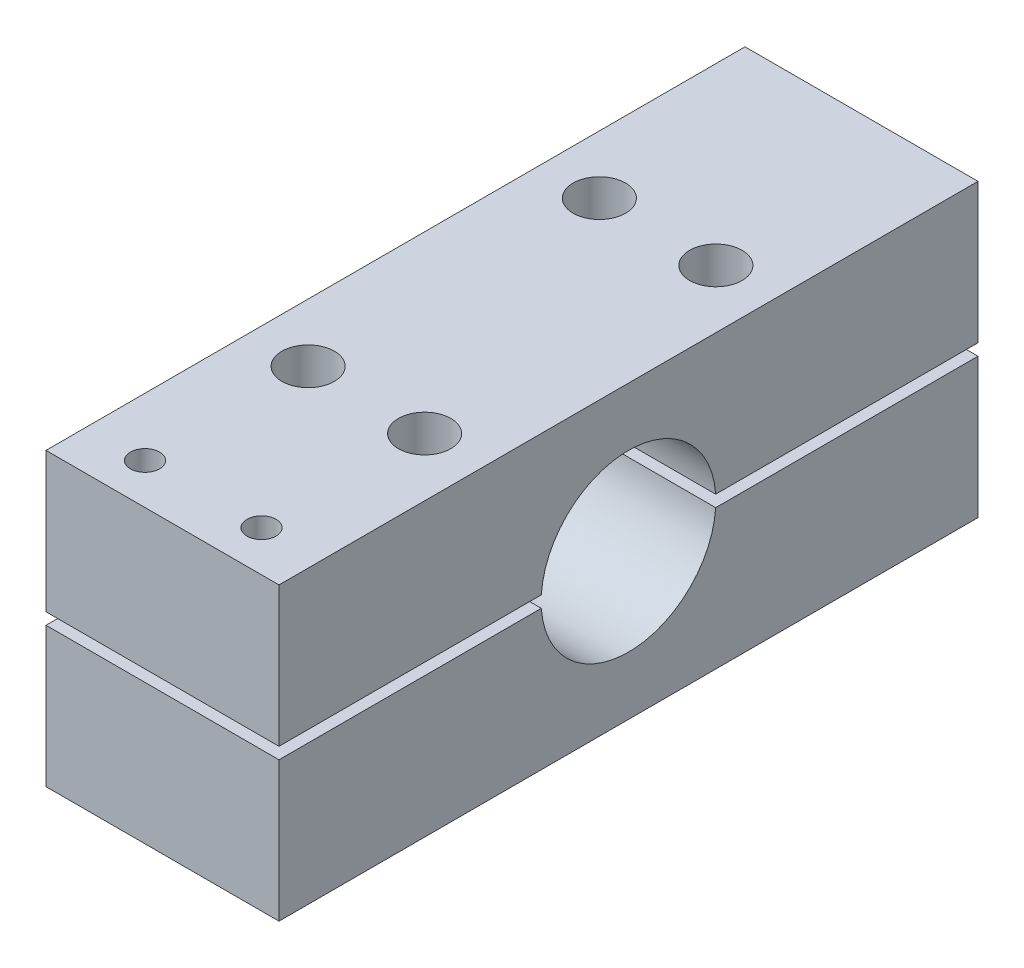
ISO-10303-21;
HEADER;
FILE_DESCRIPTION(('STEP AP214'),'2;1');
FILE_NAME('part.step','',(''),(''),'','','');
FILE_SCHEMA(('AUTOMOTIVE_DESIGN { 1 0 10303 214 1 1 1 1 }'));
ENDSEC;
DATA;
#1=APPLICATION_CONTEXT('core data for automotive mechanical design processes');
#2=APPLICATION_PROTOCOL_DEFINITION('international standard','automotive_design',2000,#1);
#3=PRODUCT_CONTEXT('',#1,'mechanical');
#4=PRODUCT('Part','Part','',(#3));
#5=PRODUCT_RELATED_PRODUCT_CATEGORY('part','',(#4));
#6=PRODUCT_DEFINITION_FORMATION('','',#4);
#7=PRODUCT_DEFINITION_CONTEXT('part definition',#1,'design');
#8=PRODUCT_DEFINITION('design','',#6,#7);
#9=PRODUCT_DEFINITION_SHAPE('','',#8);
#10=(LENGTH_UNIT() NAMED_UNIT(*) SI_UNIT(.MILLI.,.METRE.));
#11=(NAMED_UNIT(*) PLANE_ANGLE_UNIT() SI_UNIT($,.RADIAN.));
#12=(NAMED_UNIT(*) SI_UNIT($,.STERADIAN.) SOLID_ANGLE_UNIT());
#13=UNCERTAINTY_MEASURE_WITH_UNIT(LENGTH_MEASURE(1.E-05),#10,'distance_accuracy_value','');
#14=(GEOMETRIC_REPRESENTATION_CONTEXT(3) GLOBAL_UNCERTAINTY_ASSIGNED_CONTEXT((#13)) GLOBAL_UNIT_ASSIGNED_CONTEXT((#10,
#11,#12)) REPRESENTATION_CONTEXT('',''));
#15=CARTESIAN_POINT('',(0.,0.,0.));
#16=DIRECTION('',(0.,0.,1.));
#17=DIRECTION('',(1.,0.,0.));
#18=AXIS2_PLACEMENT_3D('',#15,#16,#17);
#19=CARTESIAN_POINT('',(20.,0.,0.));
#20=DIRECTION('',(1.,0.,0.));
#21=DIRECTION('',(0.,0.,-1.));
#22=AXIS2_PLACEMENT_3D('',#19,#20,#21);
#23=PLANE('',#22);
#24=DIRECTION('',(0.,0.,-1.));
#25=VECTOR('',#24,1.);
#26=CARTESIAN_POINT('',(20.,-1.,60.));
#27=LINE('',#26,#25);
#28=CARTESIAN_POINT('',(20.,-1.,60.));
#29=VERTEX_POINT('',#28);
#30=CARTESIAN_POINT('',(20.,-1.,14.9666295470958));
#31=VERTEX_POINT('',#30);
#32=EDGE_CURVE('E14',#29,#31,#27,.T.);
#33=ORIENTED_EDGE('',*,*,#32,.F.);
#34=DIRECTION('',(0.,-1.,0.));
#35=VECTOR('',#34,1.);
#36=CARTESIAN_POINT('',(20.,25.,60.));
#37=LINE('',#36,#35);
#38=CARTESIAN_POINT('',(20.,-25.,60.));
#39=VERTEX_POINT('',#38);
#40=EDGE_CURVE('E142',#29,#39,#37,.T.);
#41=ORIENTED_EDGE('',*,*,#40,.T.);
#42=DIRECTION('',(0.,0.,-1.));
#43=VECTOR('',#42,1.);
#44=CARTESIAN_POINT('',(20.,-25.,60.));
#45=LINE('',#44,#43);
#46=CARTESIAN_POINT('',(20.,-25.,-60.));
#47=VERTEX_POINT('',#46);
#48=EDGE_CURVE('E138',#39,#47,#45,.T.);
#49=ORIENTED_EDGE('',*,*,#48,.T.);
#50=DIRECTION('',(0.,1.,0.));
#51=VECTOR('',#50,1.);
#52=CARTESIAN_POINT('',(20.,25.,-60.));
#53=LINE('',#52,#51);
#54=CARTESIAN_POINT('',(20.,-1.,-60.));
#55=VERTEX_POINT('',#54);
#56=EDGE_CURVE('E136',#47,#55,#53,.T.);
#57=ORIENTED_EDGE('',*,*,#56,.T.);
#58=CARTESIAN_POINT('',(20.,-1.,-14.9666295470958));
#59=VERTEX_POINT('',#58);
#60=EDGE_CURVE('E74',#59,#55,#27,.T.);
#61=ORIENTED_EDGE('',*,*,#60,.F.);
#62=CARTESIAN_POINT('',(20.,0.,0.));
#63=DIRECTION('',(1.,0.,0.));
#64=DIRECTION('',(0.,0.,-1.));
#65=AXIS2_PLACEMENT_3D('',#62,#63,#64);
#66=CIRCLE('',#65,15.);
#67=EDGE_CURVE('E129',#31,#59,#66,.T.);
#68=ORIENTED_EDGE('',*,*,#67,.F.);
#69=EDGE_LOOP('',(#33,#41,#49,#57,#61,#68));
#70=FACE_BOUND('',#69,.T.);
#71=ADVANCED_FACE('F63',(#70),#23,.T.);
#72=CARTESIAN_POINT('',(-20.,0.,0.));
#73=DIRECTION('',(1.,0.,0.));
#74=DIRECTION('',(0.,0.,-1.));
#75=AXIS2_PLACEMENT_3D('',#72,#73,#74);
#76=PLANE('',#75);
#77=DIRECTION('',(0.,-1.,0.));
#78=VECTOR('',#77,1.);
#79=CARTESIAN_POINT('',(-20.,25.,60.));
#80=LINE('',#79,#78);
#81=CARTESIAN_POINT('',(-20.,-1.,60.));
#82=VERTEX_POINT('',#81);
#83=CARTESIAN_POINT('',(-20.,-25.,60.));
#84=VERTEX_POINT('',#83);
#85=EDGE_CURVE('E145',#82,#84,#80,.T.);
#86=ORIENTED_EDGE('',*,*,#85,.F.);
#87=DIRECTION('',(0.,0.,-1.));
#88=VECTOR('',#87,1.);
#89=CARTESIAN_POINT('',(-20.,-1.,60.));
#90=LINE('',#89,#88);
#91=CARTESIAN_POINT('',(-20.,-1.,14.9666295470958));
#92=VERTEX_POINT('',#91);
#93=EDGE_CURVE('E123',#82,#92,#90,.T.);
#94=ORIENTED_EDGE('',*,*,#93,.T.);
#95=CARTESIAN_POINT('',(-20.,0.,0.));
#96=DIRECTION('',(1.,0.,0.));
#97=DIRECTION('',(0.,0.,-1.));
#98=AXIS2_PLACEMENT_3D('',#95,#96,#97);
#99=CIRCLE('',#98,15.);
#100=CARTESIAN_POINT('',(-20.,-1.,-14.9666295470958));
#101=VERTEX_POINT('',#100);
#102=EDGE_CURVE('E66',#92,#101,#99,.T.);
#103=ORIENTED_EDGE('',*,*,#102,.T.);
#104=CARTESIAN_POINT('',(-20.,-1.,-60.));
#105=VERTEX_POINT('',#104);
#106=EDGE_CURVE('E112',#101,#105,#90,.T.);
#107=ORIENTED_EDGE('',*,*,#106,.T.);
#108=DIRECTION('',(0.,1.,0.));
#109=VECTOR('',#108,1.);
#110=CARTESIAN_POINT('',(-20.,25.,-60.));
#111=LINE('',#110,#109);
#112=CARTESIAN_POINT('',(-20.,-25.,-60.));
#113=VERTEX_POINT('',#112);
#114=EDGE_CURVE('E121',#113,#105,#111,.T.);
#115=ORIENTED_EDGE('',*,*,#114,.F.);
#116=DIRECTION('',(0.,0.,-1.));
#117=VECTOR('',#116,1.);
#118=CARTESIAN_POINT('',(-20.,-25.,60.));
#119=LINE('',#118,#117);
#120=EDGE_CURVE('E148',#84,#113,#119,.T.);
#121=ORIENTED_EDGE('',*,*,#120,.F.);
#122=EDGE_LOOP('',(#86,#94,#103,#107,#115,#121));
#123=FACE_BOUND('',#122,.T.);
#124=ADVANCED_FACE('F134',(#123),#76,.F.);
#125=CARTESIAN_POINT('',(20.,25.,-60.));
#126=DIRECTION('',(0.,0.,1.));
#127=DIRECTION('',(0.,-1.,0.));
#128=AXIS2_PLACEMENT_3D('',#125,#126,#127);
#129=PLANE('',#128);
#130=ORIENTED_EDGE('',*,*,#114,.T.);
#131=DIRECTION('',(1.,0.,0.));
#132=VECTOR('',#131,1.);
#133=CARTESIAN_POINT('',(-20.,-1.,-60.));
#134=LINE('',#133,#132);
#135=EDGE_CURVE('E110',#105,#55,#134,.T.);
#136=ORIENTED_EDGE('',*,*,#135,.T.);
#137=ORIENTED_EDGE('',*,*,#56,.F.);
#138=DIRECTION('',(-1.,0.,0.));
#139=VECTOR('',#138,1.);
#140=CARTESIAN_POINT('',(20.,-25.,-60.));
#141=LINE('',#140,#139);
#142=EDGE_CURVE('E147',#47,#113,#141,.T.);
#143=ORIENTED_EDGE('',*,*,#142,.T.);
#144=EDGE_LOOP('',(#130,#136,#137,#143));
#145=FACE_BOUND('',#144,.T.);
#146=ADVANCED_FACE('F162',(#145),#129,.F.);
#147=CARTESIAN_POINT('',(20.,25.,60.));
#148=DIRECTION('',(0.,0.,-1.));
#149=DIRECTION('',(0.,1.,0.));
#150=AXIS2_PLACEMENT_3D('',#147,#148,#149);
#151=PLANE('',#150);
#152=ORIENTED_EDGE('',*,*,#40,.F.);
#153=DIRECTION('',(1.,0.,0.));
#154=VECTOR('',#153,1.);
#155=CARTESIAN_POINT('',(-20.,-1.,60.));
#156=LINE('',#155,#154);
#157=EDGE_CURVE('E72',#82,#29,#156,.T.);
#158=ORIENTED_EDGE('',*,*,#157,.F.);
#159=ORIENTED_EDGE('',*,*,#85,.T.);
#160=DIRECTION('',(-1.,0.,0.));
#161=VECTOR('',#160,1.);
#162=CARTESIAN_POINT('',(20.,-25.,60.));
#163=LINE('',#162,#161);
#164=EDGE_CURVE('E130',#39,#84,#163,.T.);
#165=ORIENTED_EDGE('',*,*,#164,.F.);
#166=EDGE_LOOP('',(#152,#158,#159,#165));
#167=FACE_BOUND('',#166,.T.);
#168=ADVANCED_FACE('F168',(#167),#151,.F.);
#169=CARTESIAN_POINT('',(20.,0.,0.));
#170=DIRECTION('',(-1.,0.,0.));
#171=DIRECTION('',(0.,0.,1.));
#172=AXIS2_PLACEMENT_3D('',#169,#170,#171);
#173=CYLINDRICAL_SURFACE('',#172,15.);
#174=DIRECTION('',(-1.,0.,0.));
#175=VECTOR('',#174,1.);
#176=CARTESIAN_POINT('',(20.,-1.,14.9666295470958));
#177=LINE('',#176,#175);
#178=EDGE_CURVE('E159',#31,#92,#177,.T.);
#179=ORIENTED_EDGE('',*,*,#178,.F.);
#180=ORIENTED_EDGE('',*,*,#67,.T.);
#181=DIRECTION('',(-1.,0.,0.));
#182=VECTOR('',#181,1.);
#183=CARTESIAN_POINT('',(20.,-1.,-14.9666295470958));
#184=LINE('',#183,#182);
#185=EDGE_CURVE('E115',#101,#59,#184,.F.);
#186=ORIENTED_EDGE('',*,*,#185,.F.);
#187=ORIENTED_EDGE('',*,*,#102,.F.);
#188=EDGE_LOOP('',(#179,#180,#186,#187));
#189=FACE_BOUND('',#188,.T.);
#190=ADVANCED_FACE('F127',(#189),#173,.F.);
#191=CARTESIAN_POINT('',(20.,-25.,60.));
#192=DIRECTION('',(0.,1.,0.));
#193=DIRECTION('',(0.,0.,1.));
#194=AXIS2_PLACEMENT_3D('',#191,#192,#193);
#195=PLANE('',#194);
#196=CARTESIAN_POINT('',(0.,-25.,45.));
#197=DIRECTION('',(0.,1.,0.));
#198=DIRECTION('',(0.,0.,1.));
#199=AXIS2_PLACEMENT_3D('',#196,#197,#198);
#200=CIRCLE('',#199,5.5);
#201=CARTESIAN_POINT('',(0.,-25.,50.5));
#202=VERTEX_POINT('',#201);
#203=EDGE_CURVE('E208',#202,#202,#200,.T.);
#204=ORIENTED_EDGE('',*,*,#203,.T.);
#205=EDGE_LOOP('',(#204));
#206=FACE_BOUND('',#205,.T.);
#207=CARTESIAN_POINT('',(0.,-25.,-45.));
#208=DIRECTION('',(0.,1.,0.));
#209=DIRECTION('',(0.,0.,1.));
#210=AXIS2_PLACEMENT_3D('',#207,#208,#209);
#211=CIRCLE('',#210,5.5);
#212=CARTESIAN_POINT('',(0.,-25.,-39.5));
#213=VERTEX_POINT('',#212);
#214=EDGE_CURVE('E196',#213,#213,#211,.T.);
#215=ORIENTED_EDGE('',*,*,#214,.T.);
#216=EDGE_LOOP('',(#215));
#217=FACE_BOUND('',#216,.T.);
#218=CARTESIAN_POINT('',(10.,-25.,25.));
#219=DIRECTION('',(0.,1.,0.));
#220=DIRECTION('',(0.,0.,1.));
#221=AXIS2_PLACEMENT_3D('',#218,#219,#220);
#222=CIRCLE('',#221,3.4);
#223=CARTESIAN_POINT('',(10.,-25.,28.4));
#224=VERTEX_POINT('',#223);
#225=EDGE_CURVE('E190',#224,#224,#222,.T.);
#226=ORIENTED_EDGE('',*,*,#225,.T.);
#227=EDGE_LOOP('',(#226));
#228=FACE_BOUND('',#227,.T.);
#229=CARTESIAN_POINT('',(10.,-25.,-25.));
#230=DIRECTION('',(0.,1.,0.));
#231=DIRECTION('',(0.,0.,1.));
#232=AXIS2_PLACEMENT_3D('',#229,#230,#231);
#233=CIRCLE('',#232,3.4);
#234=CARTESIAN_POINT('',(10.,-25.,-21.6));
#235=VERTEX_POINT('',#234);
#236=EDGE_CURVE('E184',#235,#235,#233,.T.);
#237=ORIENTED_EDGE('',*,*,#236,.T.);
#238=EDGE_LOOP('',(#237));
#239=FACE_BOUND('',#238,.T.);
#240=CARTESIAN_POINT('',(-10.,-25.,-25.));
#241=DIRECTION('',(0.,1.,0.));
#242=DIRECTION('',(0.,0.,1.));
#243=AXIS2_PLACEMENT_3D('',#240,#241,#242);
#244=CIRCLE('',#243,3.4);
#245=CARTESIAN_POINT('',(-10.,-25.,-21.6));
#246=VERTEX_POINT('',#245);
#247=EDGE_CURVE('E178',#246,#246,#244,.T.);
#248=ORIENTED_EDGE('',*,*,#247,.T.);
#249=EDGE_LOOP('',(#248));
#250=FACE_BOUND('',#249,.T.);
#251=CARTESIAN_POINT('',(-10.,-25.,25.));
#252=DIRECTION('',(0.,1.,0.));
#253=DIRECTION('',(0.,0.,1.));
#254=AXIS2_PLACEMENT_3D('',#251,#252,#253);
#255=CIRCLE('',#254,3.4);
#256=CARTESIAN_POINT('',(-10.,-25.,28.4));
#257=VERTEX_POINT('',#256);
#258=EDGE_CURVE('E143',#257,#257,#255,.T.);
#259=ORIENTED_EDGE('',*,*,#258,.T.);
#260=EDGE_LOOP('',(#259));
#261=FACE_BOUND('',#260,.T.);
#262=ORIENTED_EDGE('',*,*,#120,.T.);
#263=ORIENTED_EDGE('',*,*,#142,.F.);
#264=ORIENTED_EDGE('',*,*,#48,.F.);
#265=ORIENTED_EDGE('',*,*,#164,.T.);
#266=EDGE_LOOP('',(#262,#263,#264,#265));
#267=FACE_BOUND('',#266,.T.);
#268=ADVANCED_FACE('F169',(#206,#217,#228,#239,#250,#261,#267),#195,.F.);
#269=CARTESIAN_POINT('',(-20.,-1.,60.));
#270=DIRECTION('',(0.,-1.,0.));
#271=DIRECTION('',(0.,0.,-1.));
#272=AXIS2_PLACEMENT_3D('',#269,#270,#271);
#273=PLANE('',#272);
#274=CARTESIAN_POINT('',(0.,-1.,-45.));
#275=DIRECTION('',(0.,1.,0.));
#276=DIRECTION('',(0.,0.,1.));
#277=AXIS2_PLACEMENT_3D('',#274,#275,#276);
#278=CIRCLE('',#277,9.);
#279=CARTESIAN_POINT('',(0.,-1.,-36.));
#280=VERTEX_POINT('',#279);
#281=EDGE_CURVE('E205',#280,#280,#278,.T.);
#282=ORIENTED_EDGE('',*,*,#281,.F.);
#283=EDGE_LOOP('',(#282));
#284=FACE_BOUND('',#283,.T.);
#285=CARTESIAN_POINT('',(10.,-0.999999999999999,-25.));
#286=DIRECTION('',(0.,1.,0.));
#287=DIRECTION('',(0.,0.,1.));
#288=AXIS2_PLACEMENT_3D('',#285,#286,#287);
#289=CIRCLE('',#288,3.39999999999999);
#290=CARTESIAN_POINT('',(10.,-0.999999999999999,-21.6));
#291=VERTEX_POINT('',#290);
#292=EDGE_CURVE('E187',#291,#291,#289,.T.);
#293=ORIENTED_EDGE('',*,*,#292,.F.);
#294=EDGE_LOOP('',(#293));
#295=FACE_BOUND('',#294,.T.);
#296=CARTESIAN_POINT('',(-10.,-0.999999999999999,-25.));
#297=DIRECTION('',(0.,1.,0.));
#298=DIRECTION('',(0.,0.,1.));
#299=AXIS2_PLACEMENT_3D('',#296,#297,#298);
#300=CIRCLE('',#299,3.39999999999999);
#301=CARTESIAN_POINT('',(-10.,-0.999999999999999,-21.6));
#302=VERTEX_POINT('',#301);
#303=EDGE_CURVE('E181',#302,#302,#300,.T.);
#304=ORIENTED_EDGE('',*,*,#303,.F.);
#305=EDGE_LOOP('',(#304));
#306=FACE_BOUND('',#305,.T.);
#307=ORIENTED_EDGE('',*,*,#185,.T.);
#308=ORIENTED_EDGE('',*,*,#60,.T.);
#309=ORIENTED_EDGE('',*,*,#135,.F.);
#310=ORIENTED_EDGE('',*,*,#106,.F.);
#311=EDGE_LOOP('',(#307,#308,#309,#310));
#312=FACE_BOUND('',#311,.T.);
#313=ADVANCED_FACE('F114',(#284,#295,#306,#312),#273,.F.);
#314=CARTESIAN_POINT('',(0.,-1.,45.));
#315=DIRECTION('',(0.,1.,0.));
#316=DIRECTION('',(0.,0.,1.));
#317=AXIS2_PLACEMENT_3D('',#314,#315,#316);
#318=CIRCLE('',#317,9.);
#319=CARTESIAN_POINT('',(0.,-1.,54.));
#320=VERTEX_POINT('',#319);
#321=EDGE_CURVE('E217',#320,#320,#318,.T.);
#322=ORIENTED_EDGE('',*,*,#321,.F.);
#323=EDGE_LOOP('',(#322));
#324=FACE_BOUND('',#323,.T.);
#325=CARTESIAN_POINT('',(10.,-0.999999999999999,25.));
#326=DIRECTION('',(0.,1.,0.));
#327=DIRECTION('',(0.,0.,1.));
#328=AXIS2_PLACEMENT_3D('',#325,#326,#327);
#329=CIRCLE('',#328,3.39999999999999);
#330=CARTESIAN_POINT('',(10.,-0.999999999999999,28.4));
#331=VERTEX_POINT('',#330);
#332=EDGE_CURVE('E193',#331,#331,#329,.T.);
#333=ORIENTED_EDGE('',*,*,#332,.F.);
#334=EDGE_LOOP('',(#333));
#335=FACE_BOUND('',#334,.T.);
#336=CARTESIAN_POINT('',(-10.,-0.999999999999999,25.));
#337=DIRECTION('',(0.,1.,0.));
#338=DIRECTION('',(0.,0.,1.));
#339=AXIS2_PLACEMENT_3D('',#336,#337,#338);
#340=CIRCLE('',#339,3.39999999999999);
#341=CARTESIAN_POINT('',(-10.,-0.999999999999999,28.4));
#342=VERTEX_POINT('',#341);
#343=EDGE_CURVE('E175',#342,#342,#340,.T.);
#344=ORIENTED_EDGE('',*,*,#343,.F.);
#345=EDGE_LOOP('',(#344));
#346=FACE_BOUND('',#345,.T.);
#347=ORIENTED_EDGE('',*,*,#178,.T.);
#348=ORIENTED_EDGE('',*,*,#93,.F.);
#349=ORIENTED_EDGE('',*,*,#157,.T.);
#350=ORIENTED_EDGE('',*,*,#32,.T.);
#351=EDGE_LOOP('',(#347,#348,#349,#350));
#352=FACE_BOUND('',#351,.T.);
#353=ADVANCED_FACE('F223',(#324,#335,#346,#352),#273,.F.);
#354=CARTESIAN_POINT('',(-10.,-1.,25.));
#355=DIRECTION('',(0.,1.,0.));
#356=DIRECTION('',(0.,0.,1.));
#357=AXIS2_PLACEMENT_3D('',#354,#355,#356);
#358=CYLINDRICAL_SURFACE('',#357,3.39999999999999);
#359=ORIENTED_EDGE('',*,*,#258,.F.);
#360=EDGE_LOOP('',(#359));
#361=FACE_BOUND('',#360,.T.);
#362=ORIENTED_EDGE('',*,*,#343,.T.);
#363=EDGE_LOOP('',(#362));
#364=FACE_BOUND('',#363,.T.);
#365=ADVANCED_FACE('F226',(#361,#364),#358,.F.);
#366=CARTESIAN_POINT('',(-10.,-1.,-25.));
#367=DIRECTION('',(0.,1.,0.));
#368=DIRECTION('',(0.,0.,1.));
#369=AXIS2_PLACEMENT_3D('',#366,#367,#368);
#370=CYLINDRICAL_SURFACE('',#369,3.39999999999999);
#371=ORIENTED_EDGE('',*,*,#247,.F.);
#372=EDGE_LOOP('',(#371));
#373=FACE_BOUND('',#372,.T.);
#374=ORIENTED_EDGE('',*,*,#303,.T.);
#375=EDGE_LOOP('',(#374));
#376=FACE_BOUND('',#375,.T.);
#377=ADVANCED_FACE('F233',(#373,#376),#370,.F.);
#378=CARTESIAN_POINT('',(10.,-1.,-25.));
#379=DIRECTION('',(0.,1.,0.));
#380=DIRECTION('',(0.,0.,1.));
#381=AXIS2_PLACEMENT_3D('',#378,#379,#380);
#382=CYLINDRICAL_SURFACE('',#381,3.39999999999999);
#383=ORIENTED_EDGE('',*,*,#236,.F.);
#384=EDGE_LOOP('',(#383));
#385=FACE_BOUND('',#384,.T.);
#386=ORIENTED_EDGE('',*,*,#292,.T.);
#387=EDGE_LOOP('',(#386));
#388=FACE_BOUND('',#387,.T.);
#389=ADVANCED_FACE('F239',(#385,#388),#382,.F.);
#390=CARTESIAN_POINT('',(10.,-1.,25.));
#391=DIRECTION('',(0.,1.,0.));
#392=DIRECTION('',(0.,0.,1.));
#393=AXIS2_PLACEMENT_3D('',#390,#391,#392);
#394=CYLINDRICAL_SURFACE('',#393,3.39999999999999);
#395=ORIENTED_EDGE('',*,*,#225,.F.);
#396=EDGE_LOOP('',(#395));
#397=FACE_BOUND('',#396,.T.);
#398=ORIENTED_EDGE('',*,*,#332,.T.);
#399=EDGE_LOOP('',(#398));
#400=FACE_BOUND('',#399,.T.);
#401=ADVANCED_FACE('F278',(#397,#400),#394,.F.);
#402=CARTESIAN_POINT('',(0.,-1.,-45.));
#403=DIRECTION('',(0.,1.,0.));
#404=DIRECTION('',(0.,0.,1.));
#405=AXIS2_PLACEMENT_3D('',#402,#403,#404);
#406=CYLINDRICAL_SURFACE('',#405,5.5);
#407=ORIENTED_EDGE('',*,*,#214,.F.);
#408=EDGE_LOOP('',(#407));
#409=FACE_BOUND('',#408,.T.);
#410=CARTESIAN_POINT('',(0.,-11.6,-45.));
#411=DIRECTION('',(0.,1.,0.));
#412=DIRECTION('',(0.,0.,1.));
#413=AXIS2_PLACEMENT_3D('',#410,#411,#412);
#414=CIRCLE('',#413,5.5);
#415=CARTESIAN_POINT('',(0.,-11.6,-39.5));
#416=VERTEX_POINT('',#415);
#417=EDGE_CURVE('E199',#416,#416,#414,.T.);
#418=ORIENTED_EDGE('',*,*,#417,.T.);
#419=EDGE_LOOP('',(#418));
#420=FACE_BOUND('',#419,.T.);
#421=ADVANCED_FACE('F285',(#409,#420),#406,.F.);
#422=CARTESIAN_POINT('',(5.5,-11.6,-45.));
#423=DIRECTION('',(0.,-1.,0.));
#424=DIRECTION('',(0.,0.,-1.));
#425=AXIS2_PLACEMENT_3D('',#422,#423,#424);
#426=PLANE('',#425);
#427=ORIENTED_EDGE('',*,*,#417,.F.);
#428=EDGE_LOOP('',(#427));
#429=FACE_BOUND('',#428,.T.);
#430=CARTESIAN_POINT('',(0.,-11.6,-45.));
#431=DIRECTION('',(0.,1.,0.));
#432=DIRECTION('',(0.,0.,1.));
#433=AXIS2_PLACEMENT_3D('',#430,#431,#432);
#434=CIRCLE('',#433,9.);
#435=CARTESIAN_POINT('',(0.,-11.6,-36.));
#436=VERTEX_POINT('',#435);
#437=EDGE_CURVE('E202',#436,#436,#434,.T.);
#438=ORIENTED_EDGE('',*,*,#437,.T.);
#439=EDGE_LOOP('',(#438));
#440=FACE_BOUND('',#439,.T.);
#441=ADVANCED_FACE('F291',(#429,#440),#426,.F.);
#442=CARTESIAN_POINT('',(0.,-1.,-45.));
#443=DIRECTION('',(0.,1.,0.));
#444=DIRECTION('',(0.,0.,1.));
#445=AXIS2_PLACEMENT_3D('',#442,#443,#444);
#446=CYLINDRICAL_SURFACE('',#445,9.);
#447=ORIENTED_EDGE('',*,*,#437,.F.);
#448=EDGE_LOOP('',(#447));
#449=FACE_BOUND('',#448,.T.);
#450=ORIENTED_EDGE('',*,*,#281,.T.);
#451=EDGE_LOOP('',(#450));
#452=FACE_BOUND('',#451,.T.);
#453=ADVANCED_FACE('F295',(#449,#452),#446,.F.);
#454=CARTESIAN_POINT('',(0.,-1.,45.));
#455=DIRECTION('',(0.,1.,0.));
#456=DIRECTION('',(0.,0.,1.));
#457=AXIS2_PLACEMENT_3D('',#454,#455,#456);
#458=CYLINDRICAL_SURFACE('',#457,5.5);
#459=ORIENTED_EDGE('',*,*,#203,.F.);
#460=EDGE_LOOP('',(#459));
#461=FACE_BOUND('',#460,.T.);
#462=CARTESIAN_POINT('',(0.,-11.6,45.));
#463=DIRECTION('',(0.,1.,0.));
#464=DIRECTION('',(0.,0.,1.));
#465=AXIS2_PLACEMENT_3D('',#462,#463,#464);
#466=CIRCLE('',#465,5.5);
#467=CARTESIAN_POINT('',(0.,-11.6,50.5));
#468=VERTEX_POINT('',#467);
#469=EDGE_CURVE('E211',#468,#468,#466,.T.);
#470=ORIENTED_EDGE('',*,*,#469,.T.);
#471=EDGE_LOOP('',(#470));
#472=FACE_BOUND('',#471,.T.);
#473=ADVANCED_FACE('F299',(#461,#472),#458,.F.);
#474=CARTESIAN_POINT('',(5.5,-11.6,45.));
#475=DIRECTION('',(0.,-1.,0.));
#476=DIRECTION('',(0.,0.,-1.));
#477=AXIS2_PLACEMENT_3D('',#474,#475,#476);
#478=PLANE('',#477);
#479=ORIENTED_EDGE('',*,*,#469,.F.);
#480=EDGE_LOOP('',(#479));
#481=FACE_BOUND('',#480,.T.);
#482=CARTESIAN_POINT('',(0.,-11.6,45.));
#483=DIRECTION('',(0.,1.,0.));
#484=DIRECTION('',(0.,0.,1.));
#485=AXIS2_PLACEMENT_3D('',#482,#483,#484);
#486=CIRCLE('',#485,9.);
#487=CARTESIAN_POINT('',(0.,-11.6,54.));
#488=VERTEX_POINT('',#487);
#489=EDGE_CURVE('E214',#488,#488,#486,.T.);
#490=ORIENTED_EDGE('',*,*,#489,.T.);
#491=EDGE_LOOP('',(#490));
#492=FACE_BOUND('',#491,.T.);
#493=ADVANCED_FACE('F303',(#481,#492),#478,.F.);
#494=CARTESIAN_POINT('',(0.,-1.,45.));
#495=DIRECTION('',(0.,1.,0.));
#496=DIRECTION('',(0.,0.,1.));
#497=AXIS2_PLACEMENT_3D('',#494,#495,#496);
#498=CYLINDRICAL_SURFACE('',#497,9.);
#499=ORIENTED_EDGE('',*,*,#489,.F.);
#500=EDGE_LOOP('',(#499));
#501=FACE_BOUND('',#500,.T.);
#502=ORIENTED_EDGE('',*,*,#321,.T.);
#503=EDGE_LOOP('',(#502));
#504=FACE_BOUND('',#503,.T.);
#505=ADVANCED_FACE('F221',(#501,#504),#498,.F.);
#506=CLOSED_SHELL('',(#71,#124,#146,#168,#190,#268,#313,#353,#365,#377,#389,#401,#421,#441,#453,
#473,#493,#505));
#507=MANIFOLD_SOLID_BREP('B2',#506);
#508=CARTESIAN_POINT('',(20.,25.,60.));
#509=DIRECTION('',(0.,-1.,0.));
#510=DIRECTION('',(0.,0.,-1.));
#511=AXIS2_PLACEMENT_3D('',#508,#509,#510);
#512=PLANE('',#511);
#513=CARTESIAN_POINT('',(-9.99999999999999,25.,53.));
#514=DIRECTION('',(0.,1.,0.));
#515=DIRECTION('',(0.,0.,1.));
#516=AXIS2_PLACEMENT_3D('',#513,#514,#515);
#517=CIRCLE('',#516,2.5);
#518=CARTESIAN_POINT('',(-9.99999999999999,25.,55.5));
#519=VERTEX_POINT('',#518);
#520=EDGE_CURVE('E505',#519,#519,#517,.T.);
#521=ORIENTED_EDGE('',*,*,#520,.F.);
#522=EDGE_LOOP('',(#521));
#523=FACE_BOUND('',#522,.T.);
#524=CARTESIAN_POINT('',(10.,25.,53.));
#525=DIRECTION('',(0.,1.,0.));
#526=DIRECTION('',(0.,0.,1.));
#527=AXIS2_PLACEMENT_3D('',#524,#525,#526);
#528=CIRCLE('',#527,2.5);
#529=CARTESIAN_POINT('',(10.,25.,55.5));
#530=VERTEX_POINT('',#529);
#531=EDGE_CURVE('E504',#530,#530,#528,.T.);
#532=ORIENTED_EDGE('',*,*,#531,.F.);
#533=EDGE_LOOP('',(#532));
#534=FACE_BOUND('',#533,.T.);
#535=CARTESIAN_POINT('',(-10.,25.,25.));
#536=DIRECTION('',(0.,1.,0.));
#537=DIRECTION('',(0.,0.,1.));
#538=AXIS2_PLACEMENT_3D('',#535,#536,#537);
#539=CIRCLE('',#538,4.5);
#540=CARTESIAN_POINT('',(-10.,25.,29.5));
#541=VERTEX_POINT('',#540);
#542=EDGE_CURVE('E515',#541,#541,#539,.T.);
#543=ORIENTED_EDGE('',*,*,#542,.F.);
#544=EDGE_LOOP('',(#543));
#545=FACE_BOUND('',#544,.T.);
#546=CARTESIAN_POINT('',(-10.,25.,-25.));
#547=DIRECTION('',(0.,1.,0.));
#548=DIRECTION('',(0.,0.,1.));
#549=AXIS2_PLACEMENT_3D('',#546,#547,#548);
#550=CIRCLE('',#549,4.5);
#551=CARTESIAN_POINT('',(-10.,25.,-20.5));
#552=VERTEX_POINT('',#551);
#553=EDGE_CURVE('E518',#552,#552,#550,.T.);
#554=ORIENTED_EDGE('',*,*,#553,.F.);
#555=EDGE_LOOP('',(#554));
#556=FACE_BOUND('',#555,.T.);
#557=CARTESIAN_POINT('',(10.,25.,-25.));
#558=DIRECTION('',(0.,1.,0.));
#559=DIRECTION('',(0.,0.,1.));
#560=AXIS2_PLACEMENT_3D('',#557,#558,#559);
#561=CIRCLE('',#560,4.5);
#562=CARTESIAN_POINT('',(10.,25.,-20.5));
#563=VERTEX_POINT('',#562);
#564=EDGE_CURVE('E522',#563,#563,#561,.T.);
#565=ORIENTED_EDGE('',*,*,#564,.F.);
#566=EDGE_LOOP('',(#565));
#567=FACE_BOUND('',#566,.T.);
#568=CARTESIAN_POINT('',(10.,25.,25.));
#569=DIRECTION('',(0.,1.,0.));
#570=DIRECTION('',(0.,0.,1.));
#571=AXIS2_PLACEMENT_3D('',#568,#569,#570);
#572=CIRCLE('',#571,4.5);
#573=CARTESIAN_POINT('',(10.,25.,29.5));
#574=VERTEX_POINT('',#573);
#575=EDGE_CURVE('E528',#574,#574,#572,.T.);
#576=ORIENTED_EDGE('',*,*,#575,.F.);
#577=EDGE_LOOP('',(#576));
#578=FACE_BOUND('',#577,.T.);
#579=DIRECTION('',(0.,0.,1.));
#580=VECTOR('',#579,1.);
#581=CARTESIAN_POINT('',(-20.,25.,60.));
#582=LINE('',#581,#580);
#583=CARTESIAN_POINT('',(-20.,25.,-60.));
#584=VERTEX_POINT('',#583);
#585=CARTESIAN_POINT('',(-20.,25.,60.));
#586=VERTEX_POINT('',#585);
#587=EDGE_CURVE('E559',#584,#586,#582,.T.);
#588=ORIENTED_EDGE('',*,*,#587,.T.);
#589=DIRECTION('',(-1.,0.,0.));
#590=VECTOR('',#589,1.);
#591=CARTESIAN_POINT('',(20.,25.,60.));
#592=LINE('',#591,#590);
#593=CARTESIAN_POINT('',(20.,25.,60.));
#594=VERTEX_POINT('',#593);
#595=EDGE_CURVE('E557',#594,#586,#592,.T.);
#596=ORIENTED_EDGE('',*,*,#595,.F.);
#597=DIRECTION('',(0.,0.,1.));
#598=VECTOR('',#597,1.);
#599=CARTESIAN_POINT('',(20.,25.,60.));
#600=LINE('',#599,#598);
#601=CARTESIAN_POINT('',(20.,25.,-60.));
#602=VERTEX_POINT('',#601);
#603=EDGE_CURVE('E551',#602,#594,#600,.T.);
#604=ORIENTED_EDGE('',*,*,#603,.F.);
#605=DIRECTION('',(-1.,0.,0.));
#606=VECTOR('',#605,1.);
#607=CARTESIAN_POINT('',(20.,25.,-60.));
#608=LINE('',#607,#606);
#609=EDGE_CURVE('E565',#602,#584,#608,.T.);
#610=ORIENTED_EDGE('',*,*,#609,.T.);
#611=EDGE_LOOP('',(#588,#596,#604,#610));
#612=FACE_BOUND('',#611,.T.);
#613=ADVANCED_FACE('F436',(#523,#534,#545,#556,#567,#578,#612),#512,.F.);
#614=CARTESIAN_POINT('',(20.,25.,60.));
#615=DIRECTION('',(0.,0.,-1.));
#616=DIRECTION('',(0.,1.,0.));
#617=AXIS2_PLACEMENT_3D('',#614,#615,#616);
#618=PLANE('',#617);
#619=DIRECTION('',(0.,-1.,0.));
#620=VECTOR('',#619,1.);
#621=CARTESIAN_POINT('',(-20.,25.,60.));
#622=LINE('',#621,#620);
#623=CARTESIAN_POINT('',(-20.,1.,60.));
#624=VERTEX_POINT('',#623);
#625=EDGE_CURVE('E552',#586,#624,#622,.T.);
#626=ORIENTED_EDGE('',*,*,#625,.T.);
#627=DIRECTION('',(1.,0.,0.));
#628=VECTOR('',#627,1.);
#629=CARTESIAN_POINT('',(-20.,1.,60.));
#630=LINE('',#629,#628);
#631=CARTESIAN_POINT('',(20.,1.,60.));
#632=VERTEX_POINT('',#631);
#633=EDGE_CURVE('E538',#624,#632,#630,.T.);
#634=ORIENTED_EDGE('',*,*,#633,.T.);
#635=DIRECTION('',(0.,-1.,0.));
#636=VECTOR('',#635,1.);
#637=CARTESIAN_POINT('',(20.,25.,60.));
#638=LINE('',#637,#636);
#639=EDGE_CURVE('E554',#594,#632,#638,.T.);
#640=ORIENTED_EDGE('',*,*,#639,.F.);
#641=ORIENTED_EDGE('',*,*,#595,.T.);
#642=EDGE_LOOP('',(#626,#634,#640,#641));
#643=FACE_BOUND('',#642,.T.);
#644=ADVANCED_FACE('F593',(#643),#618,.F.);
#645=CARTESIAN_POINT('',(20.,0.,0.));
#646=DIRECTION('',(-1.,0.,0.));
#647=DIRECTION('',(0.,0.,1.));
#648=AXIS2_PLACEMENT_3D('',#645,#646,#647);
#649=CYLINDRICAL_SURFACE('',#648,15.);
#650=DIRECTION('',(-1.,0.,0.));
#651=VECTOR('',#650,1.);
#652=CARTESIAN_POINT('',(20.,1.,-14.9666295470958));
#653=LINE('',#652,#651);
#654=CARTESIAN_POINT('',(20.,1.,-14.9666295470958));
#655=VERTEX_POINT('',#654);
#656=CARTESIAN_POINT('',(-20.,1.,-14.9666295470958));
#657=VERTEX_POINT('',#656);
#658=EDGE_CURVE('E61',#655,#657,#653,.T.);
#659=ORIENTED_EDGE('',*,*,#658,.F.);
#660=CARTESIAN_POINT('',(20.,0.,0.));
#661=DIRECTION('',(1.,0.,0.));
#662=DIRECTION('',(0.,0.,-1.));
#663=AXIS2_PLACEMENT_3D('',#660,#661,#662);
#664=CIRCLE('',#663,15.);
#665=CARTESIAN_POINT('',(20.,1.,14.9666295470958));
#666=VERTEX_POINT('',#665);
#667=EDGE_CURVE('E543',#655,#666,#664,.T.);
#668=ORIENTED_EDGE('',*,*,#667,.T.);
#669=DIRECTION('',(-1.,0.,0.));
#670=VECTOR('',#669,1.);
#671=CARTESIAN_POINT('',(20.,1.,14.9666295470958));
#672=LINE('',#671,#670);
#673=CARTESIAN_POINT('',(-20.,1.,14.9666295470958));
#674=VERTEX_POINT('',#673);
#675=EDGE_CURVE('E445',#674,#666,#672,.F.);
#676=ORIENTED_EDGE('',*,*,#675,.F.);
#677=CARTESIAN_POINT('',(-20.,0.,0.));
#678=DIRECTION('',(1.,0.,0.));
#679=DIRECTION('',(0.,0.,-1.));
#680=AXIS2_PLACEMENT_3D('',#677,#678,#679);
#681=CIRCLE('',#680,15.);
#682=EDGE_CURVE('E541',#657,#674,#681,.T.);
#683=ORIENTED_EDGE('',*,*,#682,.F.);
#684=EDGE_LOOP('',(#659,#668,#676,#683));
#685=FACE_BOUND('',#684,.T.);
#686=ADVANCED_FACE('F598',(#685),#649,.F.);
#687=CARTESIAN_POINT('',(20.,25.,-60.));
#688=DIRECTION('',(0.,0.,1.));
#689=DIRECTION('',(0.,-1.,0.));
#690=AXIS2_PLACEMENT_3D('',#687,#688,#689);
#691=PLANE('',#690);
#692=DIRECTION('',(0.,1.,0.));
#693=VECTOR('',#692,1.);
#694=CARTESIAN_POINT('',(20.,25.,-60.));
#695=LINE('',#694,#693);
#696=CARTESIAN_POINT('',(20.,1.,-60.));
#697=VERTEX_POINT('',#696);
#698=EDGE_CURVE('E549',#697,#602,#695,.T.);
#699=ORIENTED_EDGE('',*,*,#698,.F.);
#700=DIRECTION('',(1.,0.,0.));
#701=VECTOR('',#700,1.);
#702=CARTESIAN_POINT('',(-20.,1.,-60.));
#703=LINE('',#702,#701);
#704=CARTESIAN_POINT('',(-20.,1.,-60.));
#705=VERTEX_POINT('',#704);
#706=EDGE_CURVE('E535',#705,#697,#703,.T.);
#707=ORIENTED_EDGE('',*,*,#706,.F.);
#708=DIRECTION('',(0.,1.,0.));
#709=VECTOR('',#708,1.);
#710=CARTESIAN_POINT('',(-20.,25.,-60.));
#711=LINE('',#710,#709);
#712=EDGE_CURVE('E546',#705,#584,#711,.T.);
#713=ORIENTED_EDGE('',*,*,#712,.T.);
#714=ORIENTED_EDGE('',*,*,#609,.F.);
#715=EDGE_LOOP('',(#699,#707,#713,#714));
#716=FACE_BOUND('',#715,.T.);
#717=ADVANCED_FACE('F438',(#716),#691,.F.);
#718=CARTESIAN_POINT('',(-20.,0.,0.));
#719=DIRECTION('',(1.,0.,0.));
#720=DIRECTION('',(0.,0.,-1.));
#721=AXIS2_PLACEMENT_3D('',#718,#719,#720);
#722=PLANE('',#721);
#723=ORIENTED_EDGE('',*,*,#712,.F.);
#724=DIRECTION('',(0.,0.,1.));
#725=VECTOR('',#724,1.);
#726=CARTESIAN_POINT('',(-20.,1.,60.));
#727=LINE('',#726,#725);
#728=EDGE_CURVE('E532',#705,#657,#727,.T.);
#729=ORIENTED_EDGE('',*,*,#728,.T.);
#730=ORIENTED_EDGE('',*,*,#682,.T.);
#731=EDGE_CURVE('E453',#674,#624,#727,.T.);
#732=ORIENTED_EDGE('',*,*,#731,.T.);
#733=ORIENTED_EDGE('',*,*,#625,.F.);
#734=ORIENTED_EDGE('',*,*,#587,.F.);
#735=EDGE_LOOP('',(#723,#729,#730,#732,#733,#734));
#736=FACE_BOUND('',#735,.T.);
#737=ADVANCED_FACE('F604',(#736),#722,.F.);
#738=CARTESIAN_POINT('',(20.,0.,0.));
#739=DIRECTION('',(1.,0.,0.));
#740=DIRECTION('',(0.,0.,-1.));
#741=AXIS2_PLACEMENT_3D('',#738,#739,#740);
#742=PLANE('',#741);
#743=DIRECTION('',(0.,0.,1.));
#744=VECTOR('',#743,1.);
#745=CARTESIAN_POINT('',(20.,1.,60.));
#746=LINE('',#745,#744);
#747=EDGE_CURVE('E460',#697,#655,#746,.T.);
#748=ORIENTED_EDGE('',*,*,#747,.F.);
#749=ORIENTED_EDGE('',*,*,#698,.T.);
#750=ORIENTED_EDGE('',*,*,#603,.T.);
#751=ORIENTED_EDGE('',*,*,#639,.T.);
#752=EDGE_CURVE('E537',#666,#632,#746,.T.);
#753=ORIENTED_EDGE('',*,*,#752,.F.);
#754=ORIENTED_EDGE('',*,*,#667,.F.);
#755=EDGE_LOOP('',(#748,#749,#750,#751,#753,#754));
#756=FACE_BOUND('',#755,.T.);
#757=ADVANCED_FACE('F607',(#756),#742,.T.);
#758=CARTESIAN_POINT('',(-20.,1.,60.));
#759=DIRECTION('',(0.,1.,0.));
#760=DIRECTION('',(0.,0.,1.));
#761=AXIS2_PLACEMENT_3D('',#758,#759,#760);
#762=PLANE('',#761);
#763=CARTESIAN_POINT('',(-10.,1.,25.));
#764=DIRECTION('',(0.,1.,0.));
#765=DIRECTION('',(0.,0.,1.));
#766=AXIS2_PLACEMENT_3D('',#763,#764,#765);
#767=CIRCLE('',#766,4.5);
#768=CARTESIAN_POINT('',(-10.,1.,29.5));
#769=VERTEX_POINT('',#768);
#770=EDGE_CURVE('E440',#769,#769,#767,.T.);
#771=ORIENTED_EDGE('',*,*,#770,.T.);
#772=EDGE_LOOP('',(#771));
#773=FACE_BOUND('',#772,.T.);
#774=CARTESIAN_POINT('',(10.,1.,25.));
#775=DIRECTION('',(0.,1.,0.));
#776=DIRECTION('',(0.,0.,1.));
#777=AXIS2_PLACEMENT_3D('',#774,#775,#776);
#778=CIRCLE('',#777,4.5);
#779=CARTESIAN_POINT('',(10.,1.,29.5));
#780=VERTEX_POINT('',#779);
#781=EDGE_CURVE('E531',#780,#780,#778,.T.);
#782=ORIENTED_EDGE('',*,*,#781,.T.);
#783=EDGE_LOOP('',(#782));
#784=FACE_BOUND('',#783,.T.);
#785=ORIENTED_EDGE('',*,*,#675,.T.);
#786=ORIENTED_EDGE('',*,*,#752,.T.);
#787=ORIENTED_EDGE('',*,*,#633,.F.);
#788=ORIENTED_EDGE('',*,*,#731,.F.);
#789=EDGE_LOOP('',(#785,#786,#787,#788));
#790=FACE_BOUND('',#789,.T.);
#791=ADVANCED_FACE('F611',(#773,#784,#790),#762,.F.);
#792=CARTESIAN_POINT('',(-10.,1.,-25.));
#793=DIRECTION('',(0.,1.,0.));
#794=DIRECTION('',(0.,0.,1.));
#795=AXIS2_PLACEMENT_3D('',#792,#793,#794);
#796=CIRCLE('',#795,4.5);
#797=CARTESIAN_POINT('',(-10.,1.,-20.5));
#798=VERTEX_POINT('',#797);
#799=EDGE_CURVE('E521',#798,#798,#796,.T.);
#800=ORIENTED_EDGE('',*,*,#799,.T.);
#801=EDGE_LOOP('',(#800));
#802=FACE_BOUND('',#801,.T.);
#803=CARTESIAN_POINT('',(10.,1.,-25.));
#804=DIRECTION('',(0.,1.,0.));
#805=DIRECTION('',(0.,0.,1.));
#806=AXIS2_PLACEMENT_3D('',#803,#804,#805);
#807=CIRCLE('',#806,4.5);
#808=CARTESIAN_POINT('',(10.,1.,-20.5));
#809=VERTEX_POINT('',#808);
#810=EDGE_CURVE('E525',#809,#809,#807,.T.);
#811=ORIENTED_EDGE('',*,*,#810,.T.);
#812=EDGE_LOOP('',(#811));
#813=FACE_BOUND('',#812,.T.);
#814=ORIENTED_EDGE('',*,*,#658,.T.);
#815=ORIENTED_EDGE('',*,*,#728,.F.);
#816=ORIENTED_EDGE('',*,*,#706,.T.);
#817=ORIENTED_EDGE('',*,*,#747,.T.);
#818=EDGE_LOOP('',(#814,#815,#816,#817));
#819=FACE_BOUND('',#818,.T.);
#820=ADVANCED_FACE('F573',(#802,#813,#819),#762,.F.);
#821=CARTESIAN_POINT('',(10.,25.,25.));
#822=DIRECTION('',(0.,1.,0.));
#823=DIRECTION('',(0.,0.,1.));
#824=AXIS2_PLACEMENT_3D('',#821,#822,#823);
#825=CYLINDRICAL_SURFACE('',#824,4.5);
#826=ORIENTED_EDGE('',*,*,#575,.T.);
#827=EDGE_LOOP('',(#826));
#828=FACE_BOUND('',#827,.T.);
#829=ORIENTED_EDGE('',*,*,#781,.F.);
#830=EDGE_LOOP('',(#829));
#831=FACE_BOUND('',#830,.T.);
#832=ADVANCED_FACE('F589',(#828,#831),#825,.F.);
#833=CARTESIAN_POINT('',(10.,25.,-25.));
#834=DIRECTION('',(0.,1.,0.));
#835=DIRECTION('',(0.,0.,1.));
#836=AXIS2_PLACEMENT_3D('',#833,#834,#835);
#837=CYLINDRICAL_SURFACE('',#836,4.5);
#838=ORIENTED_EDGE('',*,*,#564,.T.);
#839=EDGE_LOOP('',(#838));
#840=FACE_BOUND('',#839,.T.);
#841=ORIENTED_EDGE('',*,*,#810,.F.);
#842=EDGE_LOOP('',(#841));
#843=FACE_BOUND('',#842,.T.);
#844=ADVANCED_FACE('F579',(#840,#843),#837,.F.);
#845=CARTESIAN_POINT('',(-10.,25.,-25.));
#846=DIRECTION('',(0.,1.,0.));
#847=DIRECTION('',(0.,0.,1.));
#848=AXIS2_PLACEMENT_3D('',#845,#846,#847);
#849=CYLINDRICAL_SURFACE('',#848,4.5);
#850=ORIENTED_EDGE('',*,*,#553,.T.);
#851=EDGE_LOOP('',(#850));
#852=FACE_BOUND('',#851,.T.);
#853=ORIENTED_EDGE('',*,*,#799,.F.);
#854=EDGE_LOOP('',(#853));
#855=FACE_BOUND('',#854,.T.);
#856=ADVANCED_FACE('F576',(#852,#855),#849,.F.);
#857=CARTESIAN_POINT('',(-10.,25.,25.));
#858=DIRECTION('',(0.,1.,0.));
#859=DIRECTION('',(0.,0.,1.));
#860=AXIS2_PLACEMENT_3D('',#857,#858,#859);
#861=CYLINDRICAL_SURFACE('',#860,4.5);
#862=ORIENTED_EDGE('',*,*,#542,.T.);
#863=EDGE_LOOP('',(#862));
#864=FACE_BOUND('',#863,.T.);
#865=ORIENTED_EDGE('',*,*,#770,.F.);
#866=EDGE_LOOP('',(#865));
#867=FACE_BOUND('',#866,.T.);
#868=ADVANCED_FACE('F578',(#864,#867),#861,.F.);
#869=CARTESIAN_POINT('',(10.,8.,53.));
#870=DIRECTION('',(0.,1.,0.));
#871=DIRECTION('',(0.,0.,1.));
#872=AXIS2_PLACEMENT_3D('',#869,#870,#871);
#873=CONICAL_SURFACE('',#872,2.5,1.02974425867665);
#874=CARTESIAN_POINT('',(10.,6.4978484524311,53.));
#875=VERTEX_POINT('',#874);
#876=VERTEX_LOOP('',#875);
#877=FACE_BOUND('',#876,.T.);
#878=CARTESIAN_POINT('',(10.,8.,53.));
#879=DIRECTION('',(0.,1.,0.));
#880=DIRECTION('',(0.,0.,1.));
#881=AXIS2_PLACEMENT_3D('',#878,#879,#880);
#882=CIRCLE('',#881,2.5);
#883=CARTESIAN_POINT('',(10.,8.,55.5));
#884=VERTEX_POINT('',#883);
#885=EDGE_CURVE('E508',#884,#884,#882,.T.);
#886=ORIENTED_EDGE('',*,*,#885,.T.);
#887=EDGE_LOOP('',(#886));
#888=FACE_BOUND('',#887,.T.);
#889=ADVANCED_FACE('F586',(#877,#888),#873,.F.);
#890=CARTESIAN_POINT('',(10.,25.,53.));
#891=DIRECTION('',(0.,1.,0.));
#892=DIRECTION('',(0.,0.,1.));
#893=AXIS2_PLACEMENT_3D('',#890,#891,#892);
#894=CYLINDRICAL_SURFACE('',#893,2.5);
#895=ORIENTED_EDGE('',*,*,#885,.F.);
#896=EDGE_LOOP('',(#895));
#897=FACE_BOUND('',#896,.T.);
#898=ORIENTED_EDGE('',*,*,#531,.T.);
#899=EDGE_LOOP('',(#898));
#900=FACE_BOUND('',#899,.T.);
#901=ADVANCED_FACE('F498',(#897,#900),#894,.F.);
#902=CARTESIAN_POINT('',(-9.99999999999999,8.,53.));
#903=DIRECTION('',(0.,1.,0.));
#904=DIRECTION('',(0.,0.,1.));
#905=AXIS2_PLACEMENT_3D('',#902,#903,#904);
#906=CONICAL_SURFACE('',#905,2.5,1.02974425867665);
#907=CARTESIAN_POINT('',(-9.99999999999999,6.4978484524311,53.));
#908=VERTEX_POINT('',#907);
#909=VERTEX_LOOP('',#908);
#910=FACE_BOUND('',#909,.T.);
#911=CARTESIAN_POINT('',(-9.99999999999999,8.,53.));
#912=DIRECTION('',(0.,1.,0.));
#913=DIRECTION('',(0.,0.,1.));
#914=AXIS2_PLACEMENT_3D('',#911,#912,#913);
#915=CIRCLE('',#914,2.5);
#916=CARTESIAN_POINT('',(-9.99999999999999,8.,55.5));
#917=VERTEX_POINT('',#916);
#918=EDGE_CURVE('E502',#917,#917,#915,.T.);
#919=ORIENTED_EDGE('',*,*,#918,.T.);
#920=EDGE_LOOP('',(#919));
#921=FACE_BOUND('',#920,.T.);
#922=ADVANCED_FACE('F494',(#910,#921),#906,.F.);
#923=CARTESIAN_POINT('',(-9.99999999999999,25.,53.));
#924=DIRECTION('',(0.,1.,0.));
#925=DIRECTION('',(0.,0.,1.));
#926=AXIS2_PLACEMENT_3D('',#923,#924,#925);
#927=CYLINDRICAL_SURFACE('',#926,2.5);
#928=ORIENTED_EDGE('',*,*,#918,.F.);
#929=EDGE_LOOP('',(#928));
#930=FACE_BOUND('',#929,.T.);
#931=ORIENTED_EDGE('',*,*,#520,.T.);
#932=EDGE_LOOP('',(#931));
#933=FACE_BOUND('',#932,.T.);
#934=ADVANCED_FACE('F497',(#930,#933),#927,.F.);
#935=CLOSED_SHELL('',(#613,#644,#686,#717,#737,#757,#791,#820,#832,#844,#856,#868,#889,#901,
#922,#934));
#936=MANIFOLD_SOLID_BREP('B8',#935);
#937=ADVANCED_BREP_SHAPE_REPRESENTATION('',(#18,#507,#936),#14);
#938=SHAPE_DEFINITION_REPRESENTATION(#9,#937);
ENDSEC;
END-ISO-10303-21;
